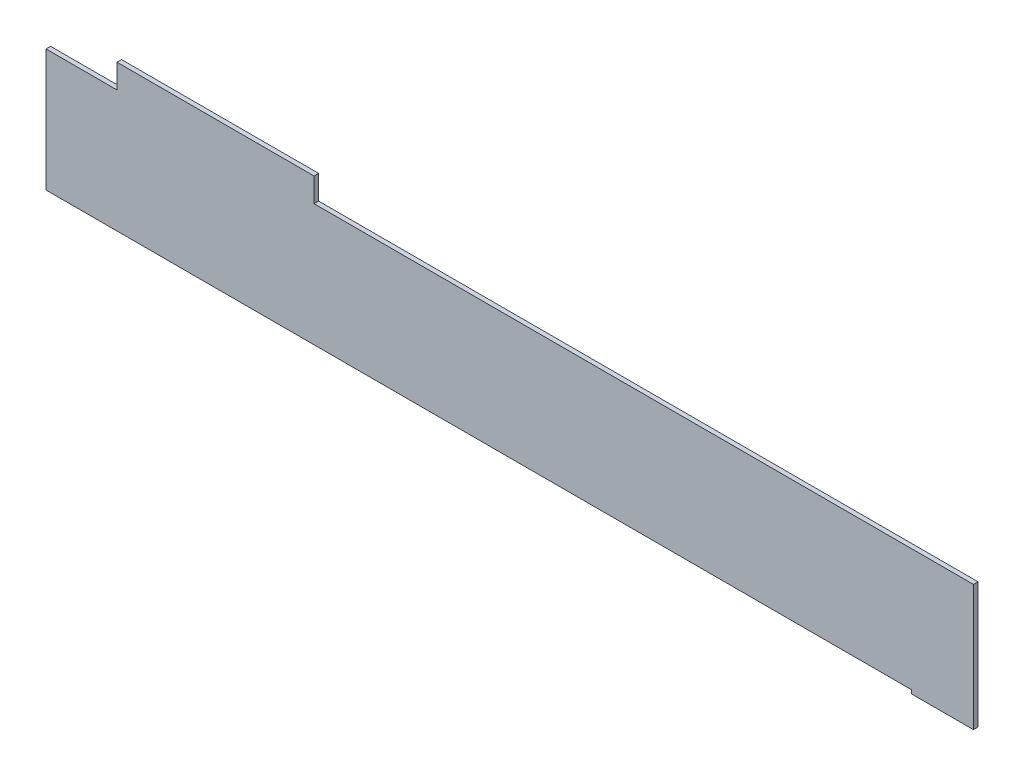
ISO-10303-21;
HEADER;
FILE_DESCRIPTION(('STEP AP214'),'2;1');
FILE_NAME('part.step','',(''),(''),'','','');
FILE_SCHEMA(('AUTOMOTIVE_DESIGN { 1 0 10303 214 1 1 1 1 }'));
ENDSEC;
DATA;
#1=APPLICATION_CONTEXT('core data for automotive mechanical design processes');
#2=APPLICATION_PROTOCOL_DEFINITION('international standard','automotive_design',2000,#1);
#3=PRODUCT_CONTEXT('',#1,'mechanical');
#4=PRODUCT('Part','Part','',(#3));
#5=PRODUCT_RELATED_PRODUCT_CATEGORY('part','',(#4));
#6=PRODUCT_DEFINITION_FORMATION('','',#4);
#7=PRODUCT_DEFINITION_CONTEXT('part definition',#1,'design');
#8=PRODUCT_DEFINITION('design','',#6,#7);
#9=PRODUCT_DEFINITION_SHAPE('','',#8);
#10=(LENGTH_UNIT() NAMED_UNIT(*) SI_UNIT(.MILLI.,.METRE.));
#11=(NAMED_UNIT(*) PLANE_ANGLE_UNIT() SI_UNIT($,.RADIAN.));
#12=(NAMED_UNIT(*) SI_UNIT($,.STERADIAN.) SOLID_ANGLE_UNIT());
#13=UNCERTAINTY_MEASURE_WITH_UNIT(LENGTH_MEASURE(1.E-05),#10,'distance_accuracy_value','');
#14=(GEOMETRIC_REPRESENTATION_CONTEXT(3) GLOBAL_UNCERTAINTY_ASSIGNED_CONTEXT((#13)) GLOBAL_UNIT_ASSIGNED_CONTEXT((#10,
#11,#12)) REPRESENTATION_CONTEXT('',''));
#15=CARTESIAN_POINT('',(0.,0.,0.));
#16=DIRECTION('',(0.,0.,1.));
#17=DIRECTION('',(1.,0.,0.));
#18=AXIS2_PLACEMENT_3D('',#15,#16,#17);
#19=CARTESIAN_POINT('',(0.,85.344,-3.175));
#20=DIRECTION('',(0.,1.,0.));
#21=DIRECTION('',(0.,0.,1.));
#22=AXIS2_PLACEMENT_3D('',#19,#20,#21);
#23=PLANE('',#22);
#24=DIRECTION('',(-1.,0.,0.));
#25=VECTOR('',#24,1.);
#26=CARTESIAN_POINT('',(0.,85.344,-3.175));
#27=LINE('',#26,#25);
#28=CARTESIAN_POINT('',(647.7,85.344,-3.175));
#29=VERTEX_POINT('',#28);
#30=CARTESIAN_POINT('',(187.2234,85.344,-3.17500000000001));
#31=VERTEX_POINT('',#30);
#32=EDGE_CURVE('E120',#29,#31,#27,.T.);
#33=ORIENTED_EDGE('',*,*,#32,.T.);
#34=DIRECTION('',(0.,0.,1.));
#35=VECTOR('',#34,1.);
#36=CARTESIAN_POINT('',(187.2234,85.344,-141.859930399809));
#37=LINE('',#36,#35);
#38=CARTESIAN_POINT('',(187.2234,85.344,0.));
#39=VERTEX_POINT('',#38);
#40=EDGE_CURVE('E125',#31,#39,#37,.T.);
#41=ORIENTED_EDGE('',*,*,#40,.T.);
#42=DIRECTION('',(-1.,0.,0.));
#43=VECTOR('',#42,1.);
#44=CARTESIAN_POINT('',(0.,85.344,0.));
#45=LINE('',#44,#43);
#46=CARTESIAN_POINT('',(647.7,85.344,0.));
#47=VERTEX_POINT('',#46);
#48=EDGE_CURVE('E151',#47,#39,#45,.T.);
#49=ORIENTED_EDGE('',*,*,#48,.F.);
#50=DIRECTION('',(0.,0.,1.));
#51=VECTOR('',#50,1.);
#52=CARTESIAN_POINT('',(647.7,85.344,-3.175));
#53=LINE('',#52,#51);
#54=EDGE_CURVE('E44',#29,#47,#53,.T.);
#55=ORIENTED_EDGE('',*,*,#54,.F.);
#56=EDGE_LOOP('',(#33,#41,#49,#55));
#57=FACE_BOUND('',#56,.T.);
#58=ADVANCED_FACE('F35',(#57),#23,.T.);
#59=CARTESIAN_POINT('',(0.,0.,-3.175));
#60=DIRECTION('',(0.,-1.,0.));
#61=DIRECTION('',(0.,0.,-1.));
#62=AXIS2_PLACEMENT_3D('',#59,#60,#61);
#63=PLANE('',#62);
#64=DIRECTION('',(1.,0.,0.));
#65=VECTOR('',#64,1.);
#66=CARTESIAN_POINT('',(0.,0.,-3.175));
#67=LINE('',#66,#65);
#68=CARTESIAN_POINT('',(0.,0.,-3.175));
#69=VERTEX_POINT('',#68);
#70=CARTESIAN_POINT('',(604.52,0.,-3.175));
#71=VERTEX_POINT('',#70);
#72=EDGE_CURVE('E181',#69,#71,#67,.T.);
#73=ORIENTED_EDGE('',*,*,#72,.T.);
#74=DIRECTION('',(0.,0.,1.));
#75=VECTOR('',#74,1.);
#76=CARTESIAN_POINT('',(604.52,0.,-46.4296413694531));
#77=LINE('',#76,#75);
#78=CARTESIAN_POINT('',(604.52,0.,0.));
#79=VERTEX_POINT('',#78);
#80=EDGE_CURVE('E164',#71,#79,#77,.T.);
#81=ORIENTED_EDGE('',*,*,#80,.T.);
#82=DIRECTION('',(1.,0.,0.));
#83=VECTOR('',#82,1.);
#84=CARTESIAN_POINT('',(0.,0.,0.));
#85=LINE('',#84,#83);
#86=CARTESIAN_POINT('',(0.,0.,0.));
#87=VERTEX_POINT('',#86);
#88=EDGE_CURVE('E143',#87,#79,#85,.T.);
#89=ORIENTED_EDGE('',*,*,#88,.F.);
#90=DIRECTION('',(0.,0.,1.));
#91=VECTOR('',#90,1.);
#92=CARTESIAN_POINT('',(0.,0.,-3.175));
#93=LINE('',#92,#91);
#94=EDGE_CURVE('E39',#69,#87,#93,.T.);
#95=ORIENTED_EDGE('',*,*,#94,.F.);
#96=EDGE_LOOP('',(#73,#81,#89,#95));
#97=FACE_BOUND('',#96,.T.);
#98=ADVANCED_FACE('F185',(#97),#63,.T.);
#99=CARTESIAN_POINT('',(0.,0.,-3.175));
#100=DIRECTION('',(-1.,0.,0.));
#101=DIRECTION('',(0.,0.,1.));
#102=AXIS2_PLACEMENT_3D('',#99,#100,#101);
#103=PLANE('',#102);
#104=DIRECTION('',(0.,-1.,0.));
#105=VECTOR('',#104,1.);
#106=CARTESIAN_POINT('',(0.,0.,0.));
#107=LINE('',#106,#105);
#108=CARTESIAN_POINT('',(0.,85.344,0.));
#109=VERTEX_POINT('',#108);
#110=EDGE_CURVE('E140',#109,#87,#107,.T.);
#111=ORIENTED_EDGE('',*,*,#110,.F.);
#112=DIRECTION('',(0.,0.,1.));
#113=VECTOR('',#112,1.);
#114=CARTESIAN_POINT('',(0.,85.344,-3.175));
#115=LINE('',#114,#113);
#116=CARTESIAN_POINT('',(0.,85.344,-3.175));
#117=VERTEX_POINT('',#116);
#118=EDGE_CURVE('E11',#117,#109,#115,.T.);
#119=ORIENTED_EDGE('',*,*,#118,.F.);
#120=DIRECTION('',(0.,-1.,0.));
#121=VECTOR('',#120,1.);
#122=CARTESIAN_POINT('',(0.,0.,-3.175));
#123=LINE('',#122,#121);
#124=EDGE_CURVE('E152',#117,#69,#123,.T.);
#125=ORIENTED_EDGE('',*,*,#124,.T.);
#126=ORIENTED_EDGE('',*,*,#94,.T.);
#127=EDGE_LOOP('',(#111,#119,#125,#126));
#128=FACE_BOUND('',#127,.T.);
#129=ADVANCED_FACE('F37',(#128),#103,.T.);
#130=DIRECTION('',(0.,0.,1.));
#131=VECTOR('',#130,1.);
#132=CARTESIAN_POINT('',(49.5554,85.344,-141.859930399809));
#133=LINE('',#132,#131);
#134=CARTESIAN_POINT('',(49.5554,85.344,-3.17500000000001));
#135=VERTEX_POINT('',#134);
#136=CARTESIAN_POINT('',(49.5554,85.344,0.));
#137=VERTEX_POINT('',#136);
#138=EDGE_CURVE('E168',#135,#137,#133,.T.);
#139=ORIENTED_EDGE('',*,*,#138,.F.);
#140=EDGE_CURVE('E134',#135,#117,#27,.T.);
#141=ORIENTED_EDGE('',*,*,#140,.T.);
#142=ORIENTED_EDGE('',*,*,#118,.T.);
#143=EDGE_CURVE('E150',#137,#109,#45,.T.);
#144=ORIENTED_EDGE('',*,*,#143,.F.);
#145=EDGE_LOOP('',(#139,#141,#142,#144));
#146=FACE_BOUND('',#145,.T.);
#147=ADVANCED_FACE('F194',(#146),#23,.T.);
#148=CARTESIAN_POINT('',(647.7,0.,-3.175));
#149=DIRECTION('',(1.,0.,0.));
#150=DIRECTION('',(0.,0.,-1.));
#151=AXIS2_PLACEMENT_3D('',#148,#149,#150);
#152=PLANE('',#151);
#153=DIRECTION('',(0.,1.,0.));
#154=VECTOR('',#153,1.);
#155=CARTESIAN_POINT('',(647.7,0.,0.));
#156=LINE('',#155,#154);
#157=CARTESIAN_POINT('',(647.7,-2.54,0.));
#158=VERTEX_POINT('',#157);
#159=EDGE_CURVE('E147',#158,#47,#156,.T.);
#160=ORIENTED_EDGE('',*,*,#159,.F.);
#161=DIRECTION('',(0.,0.,1.));
#162=VECTOR('',#161,1.);
#163=CARTESIAN_POINT('',(647.7,-2.54,-46.4296413694531));
#164=LINE('',#163,#162);
#165=CARTESIAN_POINT('',(647.7,-2.54,-3.175));
#166=VERTEX_POINT('',#165);
#167=EDGE_CURVE('E144',#166,#158,#164,.T.);
#168=ORIENTED_EDGE('',*,*,#167,.F.);
#169=DIRECTION('',(0.,1.,0.));
#170=VECTOR('',#169,1.);
#171=CARTESIAN_POINT('',(647.7,0.,-3.175));
#172=LINE('',#171,#170);
#173=EDGE_CURVE('E136',#166,#29,#172,.T.);
#174=ORIENTED_EDGE('',*,*,#173,.T.);
#175=ORIENTED_EDGE('',*,*,#54,.T.);
#176=EDGE_LOOP('',(#160,#168,#174,#175));
#177=FACE_BOUND('',#176,.T.);
#178=ADVANCED_FACE('F154',(#177),#152,.T.);
#179=CARTESIAN_POINT('',(0.,0.,-3.175));
#180=DIRECTION('',(0.,0.,-1.));
#181=DIRECTION('',(-1.,0.,0.));
#182=AXIS2_PLACEMENT_3D('',#179,#180,#181);
#183=PLANE('',#182);
#184=ORIENTED_EDGE('',*,*,#124,.F.);
#185=ORIENTED_EDGE('',*,*,#140,.F.);
#186=DIRECTION('',(0.,-1.,0.));
#187=VECTOR('',#186,1.);
#188=CARTESIAN_POINT('',(49.5554,102.108,-3.17500000000001));
#189=LINE('',#188,#187);
#190=CARTESIAN_POINT('',(49.5554,102.108,-3.17500000000001));
#191=VERTEX_POINT('',#190);
#192=EDGE_CURVE('E195',#191,#135,#189,.T.);
#193=ORIENTED_EDGE('',*,*,#192,.F.);
#194=DIRECTION('',(-1.,0.,0.));
#195=VECTOR('',#194,1.);
#196=CARTESIAN_POINT('',(49.5554,102.108,-3.17500000000001));
#197=LINE('',#196,#195);
#198=CARTESIAN_POINT('',(187.2234,102.108,-3.17500000000001));
#199=VERTEX_POINT('',#198);
#200=EDGE_CURVE('E122',#199,#191,#197,.T.);
#201=ORIENTED_EDGE('',*,*,#200,.F.);
#202=DIRECTION('',(0.,1.,0.));
#203=VECTOR('',#202,1.);
#204=CARTESIAN_POINT('',(187.2234,102.108,-3.17500000000001));
#205=LINE('',#204,#203);
#206=EDGE_CURVE('E116',#31,#199,#205,.T.);
#207=ORIENTED_EDGE('',*,*,#206,.F.);
#208=ORIENTED_EDGE('',*,*,#32,.F.);
#209=ORIENTED_EDGE('',*,*,#173,.F.);
#210=DIRECTION('',(1.,0.,0.));
#211=VECTOR('',#210,1.);
#212=CARTESIAN_POINT('',(647.7,-2.54,-3.175));
#213=LINE('',#212,#211);
#214=CARTESIAN_POINT('',(604.52,-2.54,-3.175));
#215=VERTEX_POINT('',#214);
#216=EDGE_CURVE('E172',#215,#166,#213,.T.);
#217=ORIENTED_EDGE('',*,*,#216,.F.);
#218=DIRECTION('',(0.,-1.,0.));
#219=VECTOR('',#218,1.);
#220=CARTESIAN_POINT('',(604.52,0.,-3.175));
#221=LINE('',#220,#219);
#222=EDGE_CURVE('E166',#71,#215,#221,.T.);
#223=ORIENTED_EDGE('',*,*,#222,.F.);
#224=ORIENTED_EDGE('',*,*,#72,.F.);
#225=EDGE_LOOP('',(#184,#185,#193,#201,#207,#208,#209,#217,#223,#224));
#226=FACE_BOUND('',#225,.T.);
#227=ADVANCED_FACE('F118',(#226),#183,.T.);
#228=CARTESIAN_POINT('',(0.,0.,0.));
#229=DIRECTION('',(0.,0.,-1.));
#230=DIRECTION('',(-1.,0.,0.));
#231=AXIS2_PLACEMENT_3D('',#228,#229,#230);
#232=PLANE('',#231);
#233=ORIENTED_EDGE('',*,*,#110,.T.);
#234=ORIENTED_EDGE('',*,*,#88,.T.);
#235=DIRECTION('',(0.,-1.,0.));
#236=VECTOR('',#235,1.);
#237=CARTESIAN_POINT('',(604.52,0.,0.));
#238=LINE('',#237,#236);
#239=CARTESIAN_POINT('',(604.52,-2.54,0.));
#240=VERTEX_POINT('',#239);
#241=EDGE_CURVE('E60',#79,#240,#238,.T.);
#242=ORIENTED_EDGE('',*,*,#241,.T.);
#243=DIRECTION('',(1.,0.,0.));
#244=VECTOR('',#243,1.);
#245=CARTESIAN_POINT('',(647.7,-2.54,0.));
#246=LINE('',#245,#244);
#247=EDGE_CURVE('E161',#240,#158,#246,.T.);
#248=ORIENTED_EDGE('',*,*,#247,.T.);
#249=ORIENTED_EDGE('',*,*,#159,.T.);
#250=ORIENTED_EDGE('',*,*,#48,.T.);
#251=DIRECTION('',(0.,1.,0.));
#252=VECTOR('',#251,1.);
#253=CARTESIAN_POINT('',(187.2234,102.108,0.));
#254=LINE('',#253,#252);
#255=CARTESIAN_POINT('',(187.2234,102.108,0.));
#256=VERTEX_POINT('',#255);
#257=EDGE_CURVE('E52',#39,#256,#254,.T.);
#258=ORIENTED_EDGE('',*,*,#257,.T.);
#259=DIRECTION('',(-1.,0.,0.));
#260=VECTOR('',#259,1.);
#261=CARTESIAN_POINT('',(49.5554,102.108,0.));
#262=LINE('',#261,#260);
#263=CARTESIAN_POINT('',(49.5554,102.108,0.));
#264=VERTEX_POINT('',#263);
#265=EDGE_CURVE('E131',#256,#264,#262,.T.);
#266=ORIENTED_EDGE('',*,*,#265,.T.);
#267=DIRECTION('',(0.,-1.,0.));
#268=VECTOR('',#267,1.);
#269=CARTESIAN_POINT('',(49.5554,102.108,0.));
#270=LINE('',#269,#268);
#271=EDGE_CURVE('E203',#264,#137,#270,.T.);
#272=ORIENTED_EDGE('',*,*,#271,.T.);
#273=ORIENTED_EDGE('',*,*,#143,.T.);
#274=EDGE_LOOP('',(#233,#234,#242,#248,#249,#250,#258,#266,#272,#273));
#275=FACE_BOUND('',#274,.T.);
#276=ADVANCED_FACE('F159',(#275),#232,.F.);
#277=CARTESIAN_POINT('',(604.52,0.,-46.4296413694531));
#278=DIRECTION('',(-1.,0.,0.));
#279=DIRECTION('',(0.,0.,1.));
#280=AXIS2_PLACEMENT_3D('',#277,#278,#279);
#281=PLANE('',#280);
#282=ORIENTED_EDGE('',*,*,#80,.F.);
#283=ORIENTED_EDGE('',*,*,#222,.T.);
#284=DIRECTION('',(0.,0.,1.));
#285=VECTOR('',#284,1.);
#286=CARTESIAN_POINT('',(604.52,-2.54,-46.4296413694531));
#287=LINE('',#286,#285);
#288=EDGE_CURVE('E175',#215,#240,#287,.T.);
#289=ORIENTED_EDGE('',*,*,#288,.T.);
#290=ORIENTED_EDGE('',*,*,#241,.F.);
#291=EDGE_LOOP('',(#282,#283,#289,#290));
#292=FACE_BOUND('',#291,.T.);
#293=ADVANCED_FACE('F254',(#292),#281,.T.);
#294=CARTESIAN_POINT('',(647.7,-2.54,-46.4296413694531));
#295=DIRECTION('',(0.,-1.,0.));
#296=DIRECTION('',(0.,0.,-1.));
#297=AXIS2_PLACEMENT_3D('',#294,#295,#296);
#298=PLANE('',#297);
#299=ORIENTED_EDGE('',*,*,#288,.F.);
#300=ORIENTED_EDGE('',*,*,#216,.T.);
#301=ORIENTED_EDGE('',*,*,#167,.T.);
#302=ORIENTED_EDGE('',*,*,#247,.F.);
#303=EDGE_LOOP('',(#299,#300,#301,#302));
#304=FACE_BOUND('',#303,.T.);
#305=ADVANCED_FACE('F221',(#304),#298,.T.);
#306=CARTESIAN_POINT('',(187.2234,102.108,-141.859930399809));
#307=DIRECTION('',(1.,0.,0.));
#308=DIRECTION('',(0.,0.,-1.));
#309=AXIS2_PLACEMENT_3D('',#306,#307,#308);
#310=PLANE('',#309);
#311=ORIENTED_EDGE('',*,*,#40,.F.);
#312=ORIENTED_EDGE('',*,*,#206,.T.);
#313=DIRECTION('',(0.,0.,1.));
#314=VECTOR('',#313,1.);
#315=CARTESIAN_POINT('',(187.2234,102.108,-141.859930399809));
#316=LINE('',#315,#314);
#317=EDGE_CURVE('E124',#199,#256,#316,.T.);
#318=ORIENTED_EDGE('',*,*,#317,.T.);
#319=ORIENTED_EDGE('',*,*,#257,.F.);
#320=EDGE_LOOP('',(#311,#312,#318,#319));
#321=FACE_BOUND('',#320,.T.);
#322=ADVANCED_FACE('F127',(#321),#310,.T.);
#323=CARTESIAN_POINT('',(49.5554,102.108,-141.859930399809));
#324=DIRECTION('',(0.,1.,0.));
#325=DIRECTION('',(0.,0.,1.));
#326=AXIS2_PLACEMENT_3D('',#323,#324,#325);
#327=PLANE('',#326);
#328=ORIENTED_EDGE('',*,*,#317,.F.);
#329=ORIENTED_EDGE('',*,*,#200,.T.);
#330=DIRECTION('',(0.,0.,1.));
#331=VECTOR('',#330,1.);
#332=CARTESIAN_POINT('',(49.5554,102.108,-141.859930399809));
#333=LINE('',#332,#331);
#334=EDGE_CURVE('E198',#191,#264,#333,.T.);
#335=ORIENTED_EDGE('',*,*,#334,.T.);
#336=ORIENTED_EDGE('',*,*,#265,.F.);
#337=EDGE_LOOP('',(#328,#329,#335,#336));
#338=FACE_BOUND('',#337,.T.);
#339=ADVANCED_FACE('F208',(#338),#327,.T.);
#340=CARTESIAN_POINT('',(49.5554,102.108,-141.859930399809));
#341=DIRECTION('',(-1.,0.,0.));
#342=DIRECTION('',(0.,-1.,0.));
#343=AXIS2_PLACEMENT_3D('',#340,#341,#342);
#344=PLANE('',#343);
#345=ORIENTED_EDGE('',*,*,#334,.F.);
#346=ORIENTED_EDGE('',*,*,#192,.T.);
#347=ORIENTED_EDGE('',*,*,#138,.T.);
#348=ORIENTED_EDGE('',*,*,#271,.F.);
#349=EDGE_LOOP('',(#345,#346,#347,#348));
#350=FACE_BOUND('',#349,.T.);
#351=ADVANCED_FACE('F201',(#350),#344,.T.);
#352=CLOSED_SHELL('',(#58,#98,#129,#147,#178,#227,#276,#293,#305,#322,#339,#351));
#353=MANIFOLD_SOLID_BREP('B2',#352);
#354=ADVANCED_BREP_SHAPE_REPRESENTATION('',(#18,#353),#14);
#355=SHAPE_DEFINITION_REPRESENTATION(#9,#354);
ENDSEC;
END-ISO-10303-21;
